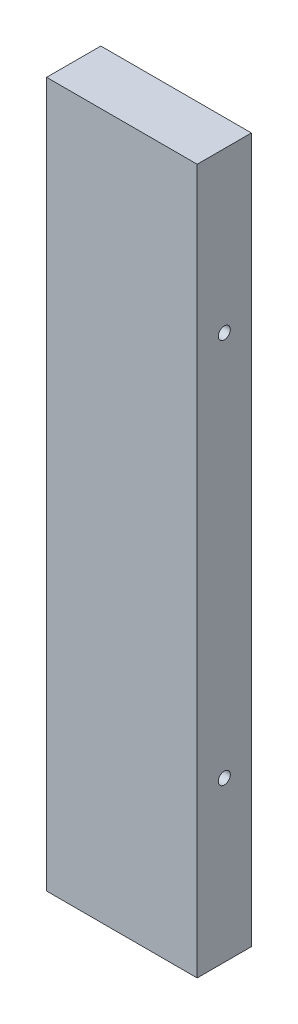
ISO-10303-21;
HEADER;
FILE_DESCRIPTION(('STEP AP214'),'2;1');
FILE_NAME('part.step','',(''),(''),'','','');
FILE_SCHEMA(('AUTOMOTIVE_DESIGN { 1 0 10303 214 1 1 1 1 }'));
ENDSEC;
DATA;
#1=APPLICATION_CONTEXT('core data for automotive mechanical design processes');
#2=APPLICATION_PROTOCOL_DEFINITION('international standard','automotive_design',2000,#1);
#3=PRODUCT_CONTEXT('',#1,'mechanical');
#4=PRODUCT('Part','Part','',(#3));
#5=PRODUCT_RELATED_PRODUCT_CATEGORY('part','',(#4));
#6=PRODUCT_DEFINITION_FORMATION('','',#4);
#7=PRODUCT_DEFINITION_CONTEXT('part definition',#1,'design');
#8=PRODUCT_DEFINITION('design','',#6,#7);
#9=PRODUCT_DEFINITION_SHAPE('','',#8);
#10=(LENGTH_UNIT() NAMED_UNIT(*) SI_UNIT(.MILLI.,.METRE.));
#11=(NAMED_UNIT(*) PLANE_ANGLE_UNIT() SI_UNIT($,.RADIAN.));
#12=(NAMED_UNIT(*) SI_UNIT($,.STERADIAN.) SOLID_ANGLE_UNIT());
#13=UNCERTAINTY_MEASURE_WITH_UNIT(LENGTH_MEASURE(1.E-05),#10,'distance_accuracy_value','');
#14=(GEOMETRIC_REPRESENTATION_CONTEXT(3) GLOBAL_UNCERTAINTY_ASSIGNED_CONTEXT((#13)) GLOBAL_UNIT_ASSIGNED_CONTEXT((#10,
#11,#12)) REPRESENTATION_CONTEXT('',''));
#15=CARTESIAN_POINT('',(0.,0.,0.));
#16=DIRECTION('',(0.,0.,1.));
#17=DIRECTION('',(1.,0.,0.));
#18=AXIS2_PLACEMENT_3D('',#15,#16,#17);
#19=CARTESIAN_POINT('',(25.,117.,18.));
#20=DIRECTION('',(-1.,0.,0.));
#21=DIRECTION('',(0.,-1.,0.));
#22=AXIS2_PLACEMENT_3D('',#19,#20,#21);
#23=PLANE('',#22);
#24=CARTESIAN_POINT('',(25.,64.0000000000005,8.99999999999994));
#25=DIRECTION('',(1.,0.,0.));
#26=DIRECTION('',(0.,0.,-1.));
#27=AXIS2_PLACEMENT_3D('',#24,#25,#26);
#28=CIRCLE('',#27,1.99999999999999);
#29=CARTESIAN_POINT('',(25.,64.0000000000005,6.99999999999995));
#30=VERTEX_POINT('',#29);
#31=EDGE_CURVE('E123',#30,#30,#28,.T.);
#32=ORIENTED_EDGE('',*,*,#31,.F.);
#33=EDGE_LOOP('',(#32));
#34=FACE_BOUND('',#33,.T.);
#35=CARTESIAN_POINT('',(25.,-63.9999999999999,8.99999999999993));
#36=DIRECTION('',(1.,0.,0.));
#37=DIRECTION('',(0.,0.,-1.));
#38=AXIS2_PLACEMENT_3D('',#35,#36,#37);
#39=CIRCLE('',#38,1.99999999999999);
#40=CARTESIAN_POINT('',(25.,-63.9999999999999,6.99999999999994));
#41=VERTEX_POINT('',#40);
#42=EDGE_CURVE('E129',#41,#41,#39,.T.);
#43=ORIENTED_EDGE('',*,*,#42,.F.);
#44=EDGE_LOOP('',(#43));
#45=FACE_BOUND('',#44,.T.);
#46=DIRECTION('',(0.,1.,0.));
#47=VECTOR('',#46,1.);
#48=CARTESIAN_POINT('',(25.,117.,0.));
#49=LINE('',#48,#47);
#50=CARTESIAN_POINT('',(25.,-117.,0.));
#51=VERTEX_POINT('',#50);
#52=CARTESIAN_POINT('',(25.,117.,0.));
#53=VERTEX_POINT('',#52);
#54=EDGE_CURVE('E135',#51,#53,#49,.T.);
#55=ORIENTED_EDGE('',*,*,#54,.T.);
#56=DIRECTION('',(0.,0.,-1.));
#57=VECTOR('',#56,1.);
#58=CARTESIAN_POINT('',(25.,117.,18.));
#59=LINE('',#58,#57);
#60=CARTESIAN_POINT('',(25.,117.,18.));
#61=VERTEX_POINT('',#60);
#62=EDGE_CURVE('E11',#61,#53,#59,.T.);
#63=ORIENTED_EDGE('',*,*,#62,.F.);
#64=DIRECTION('',(0.,1.,0.));
#65=VECTOR('',#64,1.);
#66=CARTESIAN_POINT('',(25.,117.,18.));
#67=LINE('',#66,#65);
#68=CARTESIAN_POINT('',(25.,-117.,18.));
#69=VERTEX_POINT('',#68);
#70=EDGE_CURVE('E136',#69,#61,#67,.T.);
#71=ORIENTED_EDGE('',*,*,#70,.F.);
#72=DIRECTION('',(0.,0.,-1.));
#73=VECTOR('',#72,1.);
#74=CARTESIAN_POINT('',(25.,-117.,18.));
#75=LINE('',#74,#73);
#76=EDGE_CURVE('E142',#69,#51,#75,.T.);
#77=ORIENTED_EDGE('',*,*,#76,.T.);
#78=EDGE_LOOP('',(#55,#63,#71,#77));
#79=FACE_BOUND('',#78,.T.);
#80=ADVANCED_FACE('F33',(#34,#45,#79),#23,.F.);
#81=CARTESIAN_POINT('',(-25.,117.,18.));
#82=DIRECTION('',(0.,-1.,0.));
#83=DIRECTION('',(0.,0.,-1.));
#84=AXIS2_PLACEMENT_3D('',#81,#82,#83);
#85=PLANE('',#84);
#86=DIRECTION('',(-1.,0.,0.));
#87=VECTOR('',#86,1.);
#88=CARTESIAN_POINT('',(-25.,117.,0.));
#89=LINE('',#88,#87);
#90=CARTESIAN_POINT('',(-25.,117.,0.));
#91=VERTEX_POINT('',#90);
#92=EDGE_CURVE('E145',#53,#91,#89,.T.);
#93=ORIENTED_EDGE('',*,*,#92,.T.);
#94=DIRECTION('',(0.,0.,-1.));
#95=VECTOR('',#94,1.);
#96=CARTESIAN_POINT('',(-25.,117.,18.));
#97=LINE('',#96,#95);
#98=CARTESIAN_POINT('',(-25.,117.,18.));
#99=VERTEX_POINT('',#98);
#100=EDGE_CURVE('E41',#99,#91,#97,.T.);
#101=ORIENTED_EDGE('',*,*,#100,.F.);
#102=DIRECTION('',(-1.,0.,0.));
#103=VECTOR('',#102,1.);
#104=CARTESIAN_POINT('',(-25.,117.,18.));
#105=LINE('',#104,#103);
#106=EDGE_CURVE('E80',#61,#99,#105,.T.);
#107=ORIENTED_EDGE('',*,*,#106,.F.);
#108=ORIENTED_EDGE('',*,*,#62,.T.);
#109=EDGE_LOOP('',(#93,#101,#107,#108));
#110=FACE_BOUND('',#109,.T.);
#111=ADVANCED_FACE('F168',(#110),#85,.F.);
#112=CARTESIAN_POINT('',(-25.,117.,18.));
#113=DIRECTION('',(1.,0.,0.));
#114=DIRECTION('',(0.,1.,0.));
#115=AXIS2_PLACEMENT_3D('',#112,#113,#114);
#116=PLANE('',#115);
#117=CARTESIAN_POINT('',(-25.,84.9999999999999,9.00000000000004));
#118=DIRECTION('',(-1.,0.,0.));
#119=DIRECTION('',(0.,0.,1.));
#120=AXIS2_PLACEMENT_3D('',#117,#118,#119);
#121=CIRCLE('',#120,1.99999999999999);
#122=CARTESIAN_POINT('',(-25.,84.9999999999999,11.));
#123=VERTEX_POINT('',#122);
#124=EDGE_CURVE('E107',#123,#123,#121,.T.);
#125=ORIENTED_EDGE('',*,*,#124,.F.);
#126=EDGE_LOOP('',(#125));
#127=FACE_BOUND('',#126,.T.);
#128=CARTESIAN_POINT('',(-25.,0.,9.00000000000004));
#129=DIRECTION('',(-1.,0.,0.));
#130=DIRECTION('',(0.,0.,1.));
#131=AXIS2_PLACEMENT_3D('',#128,#129,#130);
#132=CIRCLE('',#131,1.99999999999999);
#133=CARTESIAN_POINT('',(-25.,0.,11.));
#134=VERTEX_POINT('',#133);
#135=EDGE_CURVE('E106',#134,#134,#132,.T.);
#136=ORIENTED_EDGE('',*,*,#135,.F.);
#137=EDGE_LOOP('',(#136));
#138=FACE_BOUND('',#137,.T.);
#139=CARTESIAN_POINT('',(-25.,-85.,9.00000000000006));
#140=DIRECTION('',(-1.,0.,0.));
#141=DIRECTION('',(0.,0.,1.));
#142=AXIS2_PLACEMENT_3D('',#139,#140,#141);
#143=CIRCLE('',#142,1.99999999999999);
#144=CARTESIAN_POINT('',(-25.,-85.,11.0000000000001));
#145=VERTEX_POINT('',#144);
#146=EDGE_CURVE('E117',#145,#145,#143,.T.);
#147=ORIENTED_EDGE('',*,*,#146,.F.);
#148=EDGE_LOOP('',(#147));
#149=FACE_BOUND('',#148,.T.);
#150=DIRECTION('',(0.,-1.,0.));
#151=VECTOR('',#150,1.);
#152=CARTESIAN_POINT('',(-25.,117.,0.));
#153=LINE('',#152,#151);
#154=CARTESIAN_POINT('',(-25.,-117.,0.));
#155=VERTEX_POINT('',#154);
#156=EDGE_CURVE('E67',#91,#155,#153,.T.);
#157=ORIENTED_EDGE('',*,*,#156,.T.);
#158=DIRECTION('',(0.,0.,-1.));
#159=VECTOR('',#158,1.);
#160=CARTESIAN_POINT('',(-25.,-117.,18.));
#161=LINE('',#160,#159);
#162=CARTESIAN_POINT('',(-25.,-117.,18.));
#163=VERTEX_POINT('',#162);
#164=EDGE_CURVE('E150',#163,#155,#161,.T.);
#165=ORIENTED_EDGE('',*,*,#164,.F.);
#166=DIRECTION('',(0.,-1.,0.));
#167=VECTOR('',#166,1.);
#168=CARTESIAN_POINT('',(-25.,117.,18.));
#169=LINE('',#168,#167);
#170=EDGE_CURVE('E139',#99,#163,#169,.T.);
#171=ORIENTED_EDGE('',*,*,#170,.F.);
#172=ORIENTED_EDGE('',*,*,#100,.T.);
#173=EDGE_LOOP('',(#157,#165,#171,#172));
#174=FACE_BOUND('',#173,.T.);
#175=ADVANCED_FACE('F152',(#127,#138,#149,#174),#116,.F.);
#176=CARTESIAN_POINT('',(-25.,-117.,18.));
#177=DIRECTION('',(0.,1.,0.));
#178=DIRECTION('',(0.,0.,1.));
#179=AXIS2_PLACEMENT_3D('',#176,#177,#178);
#180=PLANE('',#179);
#181=DIRECTION('',(1.,0.,0.));
#182=VECTOR('',#181,1.);
#183=CARTESIAN_POINT('',(-25.,-117.,0.));
#184=LINE('',#183,#182);
#185=EDGE_CURVE('E73',#155,#51,#184,.T.);
#186=ORIENTED_EDGE('',*,*,#185,.T.);
#187=ORIENTED_EDGE('',*,*,#76,.F.);
#188=DIRECTION('',(1.,0.,0.));
#189=VECTOR('',#188,1.);
#190=CARTESIAN_POINT('',(-25.,-117.,18.));
#191=LINE('',#190,#189);
#192=EDGE_CURVE('E49',#163,#69,#191,.T.);
#193=ORIENTED_EDGE('',*,*,#192,.F.);
#194=ORIENTED_EDGE('',*,*,#164,.T.);
#195=EDGE_LOOP('',(#186,#187,#193,#194));
#196=FACE_BOUND('',#195,.T.);
#197=ADVANCED_FACE('F159',(#196),#180,.F.);
#198=CARTESIAN_POINT('',(0.,0.,18.));
#199=DIRECTION('',(0.,0.,1.));
#200=DIRECTION('',(1.,0.,0.));
#201=AXIS2_PLACEMENT_3D('',#198,#199,#200);
#202=PLANE('',#201);
#203=ORIENTED_EDGE('',*,*,#70,.T.);
#204=ORIENTED_EDGE('',*,*,#106,.T.);
#205=ORIENTED_EDGE('',*,*,#170,.T.);
#206=ORIENTED_EDGE('',*,*,#192,.T.);
#207=EDGE_LOOP('',(#203,#204,#205,#206));
#208=FACE_BOUND('',#207,.T.);
#209=ADVANCED_FACE('F161',(#208),#202,.T.);
#210=CARTESIAN_POINT('',(0.,0.,0.));
#211=DIRECTION('',(0.,0.,1.));
#212=DIRECTION('',(1.,0.,0.));
#213=AXIS2_PLACEMENT_3D('',#210,#211,#212);
#214=PLANE('',#213);
#215=ORIENTED_EDGE('',*,*,#54,.F.);
#216=ORIENTED_EDGE('',*,*,#185,.F.);
#217=ORIENTED_EDGE('',*,*,#156,.F.);
#218=ORIENTED_EDGE('',*,*,#92,.F.);
#219=EDGE_LOOP('',(#215,#216,#217,#218));
#220=FACE_BOUND('',#219,.T.);
#221=ADVANCED_FACE('F155',(#220),#214,.F.);
#222=CARTESIAN_POINT('',(-4.99999999999999,-63.9999999999999,8.99999999999993));
#223=DIRECTION('',(1.,0.,0.));
#224=DIRECTION('',(0.,0.,-1.));
#225=AXIS2_PLACEMENT_3D('',#222,#223,#224);
#226=CONICAL_SURFACE('',#225,1.99999999999999,1.02974425867665);
#227=CARTESIAN_POINT('',(-6.20172123805511,-64.,8.99999999999993));
#228=VERTEX_POINT('',#227);
#229=VERTEX_LOOP('',#228);
#230=FACE_BOUND('',#229,.T.);
#231=CARTESIAN_POINT('',(-4.99999999999999,-63.9999999999999,8.99999999999993));
#232=DIRECTION('',(1.,0.,0.));
#233=DIRECTION('',(0.,0.,-1.));
#234=AXIS2_PLACEMENT_3D('',#231,#232,#233);
#235=CIRCLE('',#234,1.99999999999999);
#236=CARTESIAN_POINT('',(-4.99999999999999,-63.9999999999999,6.99999999999994));
#237=VERTEX_POINT('',#236);
#238=EDGE_CURVE('E132',#237,#237,#235,.T.);
#239=ORIENTED_EDGE('',*,*,#238,.T.);
#240=EDGE_LOOP('',(#239));
#241=FACE_BOUND('',#240,.T.);
#242=ADVANCED_FACE('F184',(#230,#241),#226,.F.);
#243=CARTESIAN_POINT('',(25.,-63.9999999999999,8.99999999999993));
#244=DIRECTION('',(1.,0.,0.));
#245=DIRECTION('',(0.,0.,-1.));
#246=AXIS2_PLACEMENT_3D('',#243,#244,#245);
#247=CYLINDRICAL_SURFACE('',#246,1.99999999999999);
#248=ORIENTED_EDGE('',*,*,#238,.F.);
#249=EDGE_LOOP('',(#248));
#250=FACE_BOUND('',#249,.T.);
#251=ORIENTED_EDGE('',*,*,#42,.T.);
#252=EDGE_LOOP('',(#251));
#253=FACE_BOUND('',#252,.T.);
#254=ADVANCED_FACE('F181',(#250,#253),#247,.F.);
#255=CARTESIAN_POINT('',(-5.,64.0000000000005,8.99999999999994));
#256=DIRECTION('',(1.,0.,0.));
#257=DIRECTION('',(0.,0.,-1.));
#258=AXIS2_PLACEMENT_3D('',#255,#256,#257);
#259=CONICAL_SURFACE('',#258,1.99999999999999,1.02974425867665);
#260=CARTESIAN_POINT('',(-6.20172123805513,64.0000000000005,8.99999999999994));
#261=VERTEX_POINT('',#260);
#262=VERTEX_LOOP('',#261);
#263=FACE_BOUND('',#262,.T.);
#264=CARTESIAN_POINT('',(-5.,64.0000000000005,8.99999999999994));
#265=DIRECTION('',(1.,0.,0.));
#266=DIRECTION('',(0.,0.,-1.));
#267=AXIS2_PLACEMENT_3D('',#264,#265,#266);
#268=CIRCLE('',#267,1.99999999999999);
#269=CARTESIAN_POINT('',(-5.,64.0000000000005,6.99999999999995));
#270=VERTEX_POINT('',#269);
#271=EDGE_CURVE('E126',#270,#270,#268,.T.);
#272=ORIENTED_EDGE('',*,*,#271,.T.);
#273=EDGE_LOOP('',(#272));
#274=FACE_BOUND('',#273,.T.);
#275=ADVANCED_FACE('F183',(#263,#274),#259,.F.);
#276=CARTESIAN_POINT('',(25.,64.0000000000005,8.99999999999994));
#277=DIRECTION('',(1.,0.,0.));
#278=DIRECTION('',(0.,0.,-1.));
#279=AXIS2_PLACEMENT_3D('',#276,#277,#278);
#280=CYLINDRICAL_SURFACE('',#279,1.99999999999999);
#281=ORIENTED_EDGE('',*,*,#271,.F.);
#282=EDGE_LOOP('',(#281));
#283=FACE_BOUND('',#282,.T.);
#284=ORIENTED_EDGE('',*,*,#31,.T.);
#285=EDGE_LOOP('',(#284));
#286=FACE_BOUND('',#285,.T.);
#287=ADVANCED_FACE('F191',(#283,#286),#280,.F.);
#288=CARTESIAN_POINT('',(5.00000000000001,-85.,9.00000000000006));
#289=DIRECTION('',(-1.,0.,0.));
#290=DIRECTION('',(0.,0.,1.));
#291=AXIS2_PLACEMENT_3D('',#288,#289,#290);
#292=CONICAL_SURFACE('',#291,1.99999999999999,1.02974425867665);
#293=CARTESIAN_POINT('',(6.20172123805513,-85.0000000000001,9.00000000000006));
#294=VERTEX_POINT('',#293);
#295=VERTEX_LOOP('',#294);
#296=FACE_BOUND('',#295,.T.);
#297=CARTESIAN_POINT('',(5.00000000000001,-85.,9.00000000000006));
#298=DIRECTION('',(-1.,0.,0.));
#299=DIRECTION('',(0.,0.,1.));
#300=AXIS2_PLACEMENT_3D('',#297,#298,#299);
#301=CIRCLE('',#300,1.99999999999999);
#302=CARTESIAN_POINT('',(5.00000000000001,-85.,11.0000000000001));
#303=VERTEX_POINT('',#302);
#304=EDGE_CURVE('E120',#303,#303,#301,.T.);
#305=ORIENTED_EDGE('',*,*,#304,.T.);
#306=EDGE_LOOP('',(#305));
#307=FACE_BOUND('',#306,.T.);
#308=ADVANCED_FACE('F228',(#296,#307),#292,.F.);
#309=CARTESIAN_POINT('',(-25.,-85.,9.00000000000006));
#310=DIRECTION('',(-1.,0.,0.));
#311=DIRECTION('',(0.,0.,1.));
#312=AXIS2_PLACEMENT_3D('',#309,#310,#311);
#313=CYLINDRICAL_SURFACE('',#312,1.99999999999999);
#314=ORIENTED_EDGE('',*,*,#304,.F.);
#315=EDGE_LOOP('',(#314));
#316=FACE_BOUND('',#315,.T.);
#317=ORIENTED_EDGE('',*,*,#146,.T.);
#318=EDGE_LOOP('',(#317));
#319=FACE_BOUND('',#318,.T.);
#320=ADVANCED_FACE('F245',(#316,#319),#313,.F.);
#321=CARTESIAN_POINT('',(5.,0.,9.00000000000004));
#322=DIRECTION('',(-1.,0.,0.));
#323=DIRECTION('',(0.,0.,1.));
#324=AXIS2_PLACEMENT_3D('',#321,#322,#323);
#325=CONICAL_SURFACE('',#324,1.99999999999999,1.02974425867665);
#326=CARTESIAN_POINT('',(6.20172123805512,0.,9.00000000000004));
#327=VERTEX_POINT('',#326);
#328=VERTEX_LOOP('',#327);
#329=FACE_BOUND('',#328,.T.);
#330=CARTESIAN_POINT('',(5.,0.,9.00000000000004));
#331=DIRECTION('',(-1.,0.,0.));
#332=DIRECTION('',(0.,0.,1.));
#333=AXIS2_PLACEMENT_3D('',#330,#331,#332);
#334=CIRCLE('',#333,1.99999999999999);
#335=CARTESIAN_POINT('',(5.,0.,11.));
#336=VERTEX_POINT('',#335);
#337=EDGE_CURVE('E110',#336,#336,#334,.T.);
#338=ORIENTED_EDGE('',*,*,#337,.T.);
#339=EDGE_LOOP('',(#338));
#340=FACE_BOUND('',#339,.T.);
#341=ADVANCED_FACE('F255',(#329,#340),#325,.F.);
#342=CARTESIAN_POINT('',(-25.,0.,9.00000000000004));
#343=DIRECTION('',(-1.,0.,0.));
#344=DIRECTION('',(0.,0.,1.));
#345=AXIS2_PLACEMENT_3D('',#342,#343,#344);
#346=CYLINDRICAL_SURFACE('',#345,1.99999999999999);
#347=ORIENTED_EDGE('',*,*,#337,.F.);
#348=EDGE_LOOP('',(#347));
#349=FACE_BOUND('',#348,.T.);
#350=ORIENTED_EDGE('',*,*,#135,.T.);
#351=EDGE_LOOP('',(#350));
#352=FACE_BOUND('',#351,.T.);
#353=ADVANCED_FACE('F100',(#349,#352),#346,.F.);
#354=CARTESIAN_POINT('',(4.99999999999999,84.9999999999999,9.00000000000004));
#355=DIRECTION('',(-1.,0.,0.));
#356=DIRECTION('',(0.,0.,1.));
#357=AXIS2_PLACEMENT_3D('',#354,#355,#356);
#358=CONICAL_SURFACE('',#357,1.99999999999999,1.02974425867665);
#359=CARTESIAN_POINT('',(6.20172123805511,84.9999999999999,9.00000000000004));
#360=VERTEX_POINT('',#359);
#361=VERTEX_LOOP('',#360);
#362=FACE_BOUND('',#361,.T.);
#363=CARTESIAN_POINT('',(4.99999999999999,84.9999999999999,9.00000000000004));
#364=DIRECTION('',(-1.,0.,0.));
#365=DIRECTION('',(0.,0.,1.));
#366=AXIS2_PLACEMENT_3D('',#363,#364,#365);
#367=CIRCLE('',#366,1.99999999999999);
#368=CARTESIAN_POINT('',(4.99999999999999,84.9999999999999,11.));
#369=VERTEX_POINT('',#368);
#370=EDGE_CURVE('E104',#369,#369,#367,.T.);
#371=ORIENTED_EDGE('',*,*,#370,.T.);
#372=EDGE_LOOP('',(#371));
#373=FACE_BOUND('',#372,.T.);
#374=ADVANCED_FACE('F96',(#362,#373),#358,.F.);
#375=CARTESIAN_POINT('',(-25.,84.9999999999999,9.00000000000004));
#376=DIRECTION('',(-1.,0.,0.));
#377=DIRECTION('',(0.,0.,1.));
#378=AXIS2_PLACEMENT_3D('',#375,#376,#377);
#379=CYLINDRICAL_SURFACE('',#378,1.99999999999999);
#380=ORIENTED_EDGE('',*,*,#370,.F.);
#381=EDGE_LOOP('',(#380));
#382=FACE_BOUND('',#381,.T.);
#383=ORIENTED_EDGE('',*,*,#124,.T.);
#384=EDGE_LOOP('',(#383));
#385=FACE_BOUND('',#384,.T.);
#386=ADVANCED_FACE('F99',(#382,#385),#379,.F.);
#387=CLOSED_SHELL('',(#80,#111,#175,#197,#209,#221,#242,#254,#275,#287,#308,#320,#341,#353,#374,#386));
#388=MANIFOLD_SOLID_BREP('B2',#387);
#389=ADVANCED_BREP_SHAPE_REPRESENTATION('',(#18,#388),#14);
#390=SHAPE_DEFINITION_REPRESENTATION(#9,#389);
ENDSEC;
END-ISO-10303-21;
